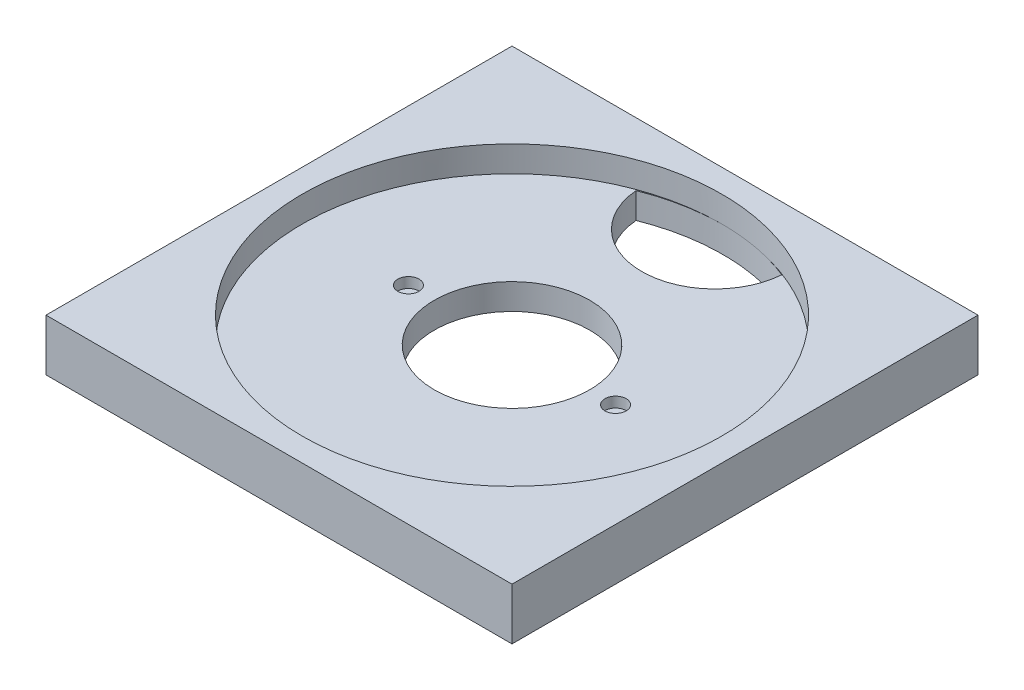
ISO-10303-21;
HEADER;
FILE_DESCRIPTION(('STEP AP214'),'2;1');
FILE_NAME('part.step','',(''),(''),'','','');
FILE_SCHEMA(('AUTOMOTIVE_DESIGN { 1 0 10303 214 1 1 1 1 }'));
ENDSEC;
DATA;
#1=APPLICATION_CONTEXT('core data for automotive mechanical design processes');
#2=APPLICATION_PROTOCOL_DEFINITION('international standard','automotive_design',2000,#1);
#3=PRODUCT_CONTEXT('',#1,'mechanical');
#4=PRODUCT('Part','Part','',(#3));
#5=PRODUCT_RELATED_PRODUCT_CATEGORY('part','',(#4));
#6=PRODUCT_DEFINITION_FORMATION('','',#4);
#7=PRODUCT_DEFINITION_CONTEXT('part definition',#1,'design');
#8=PRODUCT_DEFINITION('design','',#6,#7);
#9=PRODUCT_DEFINITION_SHAPE('','',#8);
#10=(LENGTH_UNIT() NAMED_UNIT(*) SI_UNIT(.MILLI.,.METRE.));
#11=(NAMED_UNIT(*) PLANE_ANGLE_UNIT() SI_UNIT($,.RADIAN.));
#12=(NAMED_UNIT(*) SI_UNIT($,.STERADIAN.) SOLID_ANGLE_UNIT());
#13=UNCERTAINTY_MEASURE_WITH_UNIT(LENGTH_MEASURE(1.E-05),#10,'distance_accuracy_value','');
#14=(GEOMETRIC_REPRESENTATION_CONTEXT(3) GLOBAL_UNCERTAINTY_ASSIGNED_CONTEXT((#13)) GLOBAL_UNIT_ASSIGNED_CONTEXT((#10,
#11,#12)) REPRESENTATION_CONTEXT('',''));
#15=CARTESIAN_POINT('',(0.,0.,0.));
#16=DIRECTION('',(0.,0.,1.));
#17=DIRECTION('',(1.,0.,0.));
#18=AXIS2_PLACEMENT_3D('',#15,#16,#17);
#19=CARTESIAN_POINT('',(0.,0.,0.));
#20=DIRECTION('',(0.,-1.,0.));
#21=DIRECTION('',(0.,0.,-1.));
#22=AXIS2_PLACEMENT_3D('',#19,#20,#21);
#23=PLANE('',#22);
#24=DIRECTION('',(-1.,0.,0.));
#25=VECTOR('',#24,1.);
#26=CARTESIAN_POINT('',(-45.,0.,-45.));
#27=LINE('',#26,#25);
#28=CARTESIAN_POINT('',(45.,0.,-45.));
#29=VERTEX_POINT('',#28);
#30=CARTESIAN_POINT('',(-45.,0.,-45.));
#31=VERTEX_POINT('',#30);
#32=EDGE_CURVE('E140',#29,#31,#27,.T.);
#33=ORIENTED_EDGE('',*,*,#32,.F.);
#34=DIRECTION('',(0.,0.,-1.));
#35=VECTOR('',#34,1.);
#36=CARTESIAN_POINT('',(45.,0.,-45.));
#37=LINE('',#36,#35);
#38=CARTESIAN_POINT('',(45.,0.,45.));
#39=VERTEX_POINT('',#38);
#40=EDGE_CURVE('E147',#39,#29,#37,.T.);
#41=ORIENTED_EDGE('',*,*,#40,.F.);
#42=DIRECTION('',(1.,0.,0.));
#43=VECTOR('',#42,1.);
#44=CARTESIAN_POINT('',(45.,0.,45.));
#45=LINE('',#44,#43);
#46=CARTESIAN_POINT('',(-45.,0.,45.));
#47=VERTEX_POINT('',#46);
#48=EDGE_CURVE('E158',#47,#39,#45,.T.);
#49=ORIENTED_EDGE('',*,*,#48,.F.);
#50=DIRECTION('',(0.,0.,1.));
#51=VECTOR('',#50,1.);
#52=CARTESIAN_POINT('',(-45.,0.,45.));
#53=LINE('',#52,#51);
#54=EDGE_CURVE('E155',#31,#47,#53,.T.);
#55=ORIENTED_EDGE('',*,*,#54,.F.);
#56=EDGE_LOOP('',(#33,#41,#49,#55));
#57=FACE_BOUND('',#56,.T.);
#58=CARTESIAN_POINT('',(0.,0.,0.));
#59=DIRECTION('',(0.,1.,0.));
#60=DIRECTION('',(0.,0.,1.));
#61=AXIS2_PLACEMENT_3D('',#58,#59,#60);
#62=CIRCLE('',#61,15.);
#63=CARTESIAN_POINT('',(0.,0.,15.));
#64=VERTEX_POINT('',#63);
#65=EDGE_CURVE('E120',#64,#64,#62,.T.);
#66=ORIENTED_EDGE('',*,*,#65,.T.);
#67=EDGE_LOOP('',(#66));
#68=FACE_BOUND('',#67,.T.);
#69=CARTESIAN_POINT('',(0.234545087504076,0.,-38.9391662557764));
#70=DIRECTION('',(0.,-1.,0.));
#71=DIRECTION('',(0.,0.,-1.));
#72=AXIS2_PLACEMENT_3D('',#69,#70,#71);
#73=CIRCLE('',#72,14.1220477581371);
#74=CARTESIAN_POINT('',(14.3106117901516,0.,-37.800491997824));
#75=VERTEX_POINT('',#74);
#76=CARTESIAN_POINT('',(-13.8415216151434,0.,-37.800491997824));
#77=VERTEX_POINT('',#76);
#78=EDGE_CURVE('E98',#75,#77,#73,.T.);
#79=ORIENTED_EDGE('',*,*,#78,.F.);
#80=CARTESIAN_POINT('',(0.234545087504078,0.,-2.50368837224554));
#81=DIRECTION('',(0.,-1.,0.));
#82=DIRECTION('',(0.,0.,-1.));
#83=AXIS2_PLACEMENT_3D('',#80,#81,#82);
#84=CIRCLE('',#83,38.0000000000004);
#85=EDGE_CURVE('E100',#75,#77,#84,.F.);
#86=ORIENTED_EDGE('',*,*,#85,.T.);
#87=EDGE_LOOP('',(#79,#86));
#88=FACE_BOUND('',#87,.T.);
#89=ADVANCED_FACE('F39',(#57,#68,#88),#23,.T.);
#90=CARTESIAN_POINT('',(-45.,10.,-45.));
#91=DIRECTION('',(0.,0.,1.));
#92=DIRECTION('',(1.,0.,0.));
#93=AXIS2_PLACEMENT_3D('',#90,#91,#92);
#94=PLANE('',#93);
#95=ORIENTED_EDGE('',*,*,#32,.T.);
#96=DIRECTION('',(0.,-1.,0.));
#97=VECTOR('',#96,1.);
#98=CARTESIAN_POINT('',(-45.,10.,-45.));
#99=LINE('',#98,#97);
#100=CARTESIAN_POINT('',(-45.,10.,-45.));
#101=VERTEX_POINT('',#100);
#102=EDGE_CURVE('E47',#101,#31,#99,.T.);
#103=ORIENTED_EDGE('',*,*,#102,.F.);
#104=DIRECTION('',(-1.,0.,0.));
#105=VECTOR('',#104,1.);
#106=CARTESIAN_POINT('',(0.,10.,-45.));
#107=LINE('',#106,#105);
#108=CARTESIAN_POINT('',(45.,10.,-45.));
#109=VERTEX_POINT('',#108);
#110=EDGE_CURVE('E144',#109,#101,#107,.T.);
#111=ORIENTED_EDGE('',*,*,#110,.F.);
#112=DIRECTION('',(0.,-1.,0.));
#113=VECTOR('',#112,1.);
#114=CARTESIAN_POINT('',(45.,10.,-45.));
#115=LINE('',#114,#113);
#116=EDGE_CURVE('E153',#109,#29,#115,.T.);
#117=ORIENTED_EDGE('',*,*,#116,.T.);
#118=EDGE_LOOP('',(#95,#103,#111,#117));
#119=FACE_BOUND('',#118,.T.);
#120=ADVANCED_FACE('F41',(#119),#94,.F.);
#121=CARTESIAN_POINT('',(-45.,10.,45.));
#122=DIRECTION('',(1.,0.,0.));
#123=DIRECTION('',(0.,0.,-1.));
#124=AXIS2_PLACEMENT_3D('',#121,#122,#123);
#125=PLANE('',#124);
#126=ORIENTED_EDGE('',*,*,#54,.T.);
#127=DIRECTION('',(0.,-1.,0.));
#128=VECTOR('',#127,1.);
#129=CARTESIAN_POINT('',(-45.,10.,45.));
#130=LINE('',#129,#128);
#131=CARTESIAN_POINT('',(-45.,10.,45.));
#132=VERTEX_POINT('',#131);
#133=EDGE_CURVE('E167',#132,#47,#130,.T.);
#134=ORIENTED_EDGE('',*,*,#133,.F.);
#135=DIRECTION('',(0.,0.,1.));
#136=VECTOR('',#135,1.);
#137=CARTESIAN_POINT('',(-45.,10.,45.));
#138=LINE('',#137,#136);
#139=EDGE_CURVE('E146',#101,#132,#138,.T.);
#140=ORIENTED_EDGE('',*,*,#139,.F.);
#141=ORIENTED_EDGE('',*,*,#102,.T.);
#142=EDGE_LOOP('',(#126,#134,#140,#141));
#143=FACE_BOUND('',#142,.T.);
#144=ADVANCED_FACE('F174',(#143),#125,.F.);
#145=CARTESIAN_POINT('',(45.,10.,45.));
#146=DIRECTION('',(0.,0.,-1.));
#147=DIRECTION('',(-1.,0.,0.));
#148=AXIS2_PLACEMENT_3D('',#145,#146,#147);
#149=PLANE('',#148);
#150=ORIENTED_EDGE('',*,*,#48,.T.);
#151=DIRECTION('',(0.,-1.,0.));
#152=VECTOR('',#151,1.);
#153=CARTESIAN_POINT('',(45.,10.,45.));
#154=LINE('',#153,#152);
#155=CARTESIAN_POINT('',(45.,10.,45.));
#156=VERTEX_POINT('',#155);
#157=EDGE_CURVE('E164',#156,#39,#154,.T.);
#158=ORIENTED_EDGE('',*,*,#157,.F.);
#159=DIRECTION('',(1.,0.,0.));
#160=VECTOR('',#159,1.);
#161=CARTESIAN_POINT('',(0.,10.,45.));
#162=LINE('',#161,#160);
#163=EDGE_CURVE('E149',#132,#156,#162,.T.);
#164=ORIENTED_EDGE('',*,*,#163,.F.);
#165=ORIENTED_EDGE('',*,*,#133,.T.);
#166=EDGE_LOOP('',(#150,#158,#164,#165));
#167=FACE_BOUND('',#166,.T.);
#168=ADVANCED_FACE('F183',(#167),#149,.F.);
#169=CARTESIAN_POINT('',(45.,10.,-45.));
#170=DIRECTION('',(-1.,0.,0.));
#171=DIRECTION('',(0.,0.,1.));
#172=AXIS2_PLACEMENT_3D('',#169,#170,#171);
#173=PLANE('',#172);
#174=ORIENTED_EDGE('',*,*,#40,.T.);
#175=ORIENTED_EDGE('',*,*,#116,.F.);
#176=DIRECTION('',(0.,0.,-1.));
#177=VECTOR('',#176,1.);
#178=CARTESIAN_POINT('',(45.,10.,-45.));
#179=LINE('',#178,#177);
#180=EDGE_CURVE('E151',#156,#109,#179,.T.);
#181=ORIENTED_EDGE('',*,*,#180,.F.);
#182=ORIENTED_EDGE('',*,*,#157,.T.);
#183=EDGE_LOOP('',(#174,#175,#181,#182));
#184=FACE_BOUND('',#183,.T.);
#185=ADVANCED_FACE('F187',(#184),#173,.F.);
#186=CARTESIAN_POINT('',(0.,10.,0.));
#187=DIRECTION('',(0.,-1.,0.));
#188=DIRECTION('',(0.,0.,-1.));
#189=AXIS2_PLACEMENT_3D('',#186,#187,#188);
#190=PLANE('',#189);
#191=CARTESIAN_POINT('',(0.,10.,0.));
#192=DIRECTION('',(0.,1.,0.));
#193=DIRECTION('',(0.,0.,1.));
#194=AXIS2_PLACEMENT_3D('',#191,#192,#193);
#195=CIRCLE('',#194,40.5);
#196=CARTESIAN_POINT('',(0.,10.,40.5));
#197=VERTEX_POINT('',#196);
#198=EDGE_CURVE('E129',#197,#197,#195,.T.);
#199=ORIENTED_EDGE('',*,*,#198,.F.);
#200=EDGE_LOOP('',(#199));
#201=FACE_BOUND('',#200,.T.);
#202=ORIENTED_EDGE('',*,*,#110,.T.);
#203=ORIENTED_EDGE('',*,*,#139,.T.);
#204=ORIENTED_EDGE('',*,*,#163,.T.);
#205=ORIENTED_EDGE('',*,*,#180,.T.);
#206=EDGE_LOOP('',(#202,#203,#204,#205));
#207=FACE_BOUND('',#206,.T.);
#208=ADVANCED_FACE('F190',(#201,#207),#190,.F.);
#209=CARTESIAN_POINT('',(0.,5.,0.));
#210=DIRECTION('',(0.,1.,0.));
#211=DIRECTION('',(0.,0.,1.));
#212=AXIS2_PLACEMENT_3D('',#209,#210,#211);
#213=CYLINDRICAL_SURFACE('',#212,40.5);
#214=CARTESIAN_POINT('',(0.,5.,0.));
#215=DIRECTION('',(0.,1.,0.));
#216=DIRECTION('',(0.,0.,1.));
#217=AXIS2_PLACEMENT_3D('',#214,#215,#216);
#218=CIRCLE('',#217,40.5);
#219=CARTESIAN_POINT('',(7.96690062199776,5.,-39.7086702683332));
#220=VERTEX_POINT('',#219);
#221=CARTESIAN_POINT('',(-0.453204015702651,5.,-40.4974641937017));
#222=VERTEX_POINT('',#221);
#223=EDGE_CURVE('E138',#220,#222,#218,.T.);
#224=ORIENTED_EDGE('',*,*,#223,.F.);
#225=EDGE_CURVE('E141',#222,#220,#218,.T.);
#226=ORIENTED_EDGE('',*,*,#225,.F.);
#227=EDGE_LOOP('',(#224,#226));
#228=FACE_BOUND('',#227,.T.);
#229=ORIENTED_EDGE('',*,*,#198,.T.);
#230=EDGE_LOOP('',(#229));
#231=FACE_BOUND('',#230,.T.);
#232=ADVANCED_FACE('F223',(#228,#231),#213,.F.);
#233=CARTESIAN_POINT('',(0.,5.,0.));
#234=DIRECTION('',(0.,1.,0.));
#235=DIRECTION('',(0.,0.,1.));
#236=AXIS2_PLACEMENT_3D('',#233,#234,#235);
#237=PLANE('',#236);
#238=CARTESIAN_POINT('',(0.,5.,0.));
#239=DIRECTION('',(0.,1.,0.));
#240=DIRECTION('',(0.,0.,1.));
#241=AXIS2_PLACEMENT_3D('',#238,#239,#240);
#242=CIRCLE('',#241,15.);
#243=CARTESIAN_POINT('',(0.,5.,15.));
#244=VERTEX_POINT('',#243);
#245=EDGE_CURVE('E119',#244,#244,#242,.T.);
#246=ORIENTED_EDGE('',*,*,#245,.F.);
#247=EDGE_LOOP('',(#246));
#248=FACE_BOUND('',#247,.T.);
#249=CARTESIAN_POINT('',(-20.,5.,0.));
#250=DIRECTION('',(0.,1.,0.));
#251=DIRECTION('',(0.,0.,1.));
#252=AXIS2_PLACEMENT_3D('',#249,#250,#251);
#253=CIRCLE('',#252,2.05);
#254=CARTESIAN_POINT('',(-20.,5.,2.05));
#255=VERTEX_POINT('',#254);
#256=EDGE_CURVE('E130',#255,#255,#253,.T.);
#257=ORIENTED_EDGE('',*,*,#256,.F.);
#258=EDGE_LOOP('',(#257));
#259=FACE_BOUND('',#258,.T.);
#260=CARTESIAN_POINT('',(20.,5.,0.));
#261=DIRECTION('',(0.,1.,0.));
#262=DIRECTION('',(0.,0.,1.));
#263=AXIS2_PLACEMENT_3D('',#260,#261,#262);
#264=CIRCLE('',#263,2.05);
#265=CARTESIAN_POINT('',(20.,5.,2.05));
#266=VERTEX_POINT('',#265);
#267=EDGE_CURVE('E133',#266,#266,#264,.T.);
#268=ORIENTED_EDGE('',*,*,#267,.F.);
#269=EDGE_LOOP('',(#268));
#270=FACE_BOUND('',#269,.T.);
#271=CARTESIAN_POINT('',(0.234545087504076,5.,-38.9391662557764));
#272=DIRECTION('',(0.,1.,0.));
#273=DIRECTION('',(0.,0.,1.));
#274=AXIS2_PLACEMENT_3D('',#271,#272,#273);
#275=CIRCLE('',#274,14.1220477581371);
#276=CARTESIAN_POINT('',(-13.8415216151434,5.,-37.800491997824));
#277=VERTEX_POINT('',#276);
#278=CARTESIAN_POINT('',(14.3106117901516,5.,-37.800491997824));
#279=VERTEX_POINT('',#278);
#280=EDGE_CURVE('E61',#277,#279,#275,.T.);
#281=ORIENTED_EDGE('',*,*,#280,.F.);
#282=CARTESIAN_POINT('',(0.234545087504078,5.,-2.50368837224554));
#283=DIRECTION('',(0.,-1.,0.));
#284=DIRECTION('',(0.,0.,-1.));
#285=AXIS2_PLACEMENT_3D('',#282,#283,#284);
#286=CIRCLE('',#285,38.0000000000004);
#287=EDGE_CURVE('E105',#277,#222,#286,.T.);
#288=ORIENTED_EDGE('',*,*,#287,.T.);
#289=ORIENTED_EDGE('',*,*,#225,.T.);
#290=CARTESIAN_POINT('',(0.234545087504078,5.,-2.50368837224554));
#291=DIRECTION('',(0.,1.,0.));
#292=DIRECTION('',(0.,0.,1.));
#293=AXIS2_PLACEMENT_3D('',#290,#291,#292);
#294=CIRCLE('',#293,38.0000000000004);
#295=EDGE_CURVE('E11',#220,#279,#294,.F.);
#296=ORIENTED_EDGE('',*,*,#295,.T.);
#297=EDGE_LOOP('',(#281,#288,#289,#296));
#298=FACE_BOUND('',#297,.T.);
#299=ADVANCED_FACE('F113',(#248,#259,#270,#298),#237,.T.);
#300=CARTESIAN_POINT('',(20.,3.,0.));
#301=DIRECTION('',(0.,1.,0.));
#302=DIRECTION('',(0.,0.,1.));
#303=AXIS2_PLACEMENT_3D('',#300,#301,#302);
#304=CYLINDRICAL_SURFACE('',#303,2.05);
#305=CARTESIAN_POINT('',(20.,3.,0.));
#306=DIRECTION('',(0.,1.,0.));
#307=DIRECTION('',(0.,0.,1.));
#308=AXIS2_PLACEMENT_3D('',#305,#306,#307);
#309=CIRCLE('',#308,2.05);
#310=CARTESIAN_POINT('',(20.,3.,2.05));
#311=VERTEX_POINT('',#310);
#312=EDGE_CURVE('E123',#311,#311,#309,.T.);
#313=ORIENTED_EDGE('',*,*,#312,.F.);
#314=EDGE_LOOP('',(#313));
#315=FACE_BOUND('',#314,.T.);
#316=ORIENTED_EDGE('',*,*,#267,.T.);
#317=EDGE_LOOP('',(#316));
#318=FACE_BOUND('',#317,.T.);
#319=ADVANCED_FACE('F229',(#315,#318),#304,.F.);
#320=CARTESIAN_POINT('',(20.,3.,0.));
#321=DIRECTION('',(0.,1.,0.));
#322=DIRECTION('',(0.,0.,1.));
#323=AXIS2_PLACEMENT_3D('',#320,#321,#322);
#324=PLANE('',#323);
#325=ORIENTED_EDGE('',*,*,#312,.T.);
#326=EDGE_LOOP('',(#325));
#327=FACE_BOUND('',#326,.T.);
#328=ADVANCED_FACE('F233',(#327),#324,.T.);
#329=CARTESIAN_POINT('',(-20.,3.,0.));
#330=DIRECTION('',(0.,1.,0.));
#331=DIRECTION('',(0.,0.,1.));
#332=AXIS2_PLACEMENT_3D('',#329,#330,#331);
#333=CYLINDRICAL_SURFACE('',#332,2.05);
#334=CARTESIAN_POINT('',(-20.,3.,0.));
#335=DIRECTION('',(0.,1.,0.));
#336=DIRECTION('',(0.,0.,1.));
#337=AXIS2_PLACEMENT_3D('',#334,#335,#336);
#338=CIRCLE('',#337,2.05);
#339=CARTESIAN_POINT('',(-20.,3.,2.05));
#340=VERTEX_POINT('',#339);
#341=EDGE_CURVE('E126',#340,#340,#338,.T.);
#342=ORIENTED_EDGE('',*,*,#341,.F.);
#343=EDGE_LOOP('',(#342));
#344=FACE_BOUND('',#343,.T.);
#345=ORIENTED_EDGE('',*,*,#256,.T.);
#346=EDGE_LOOP('',(#345));
#347=FACE_BOUND('',#346,.T.);
#348=ADVANCED_FACE('F243',(#344,#347),#333,.F.);
#349=CARTESIAN_POINT('',(-20.,3.,0.));
#350=DIRECTION('',(0.,1.,0.));
#351=DIRECTION('',(0.,0.,1.));
#352=AXIS2_PLACEMENT_3D('',#349,#350,#351);
#353=PLANE('',#352);
#354=ORIENTED_EDGE('',*,*,#341,.T.);
#355=EDGE_LOOP('',(#354));
#356=FACE_BOUND('',#355,.T.);
#357=ADVANCED_FACE('F252',(#356),#353,.T.);
#358=CARTESIAN_POINT('',(0.,0.,0.));
#359=DIRECTION('',(0.,1.,0.));
#360=DIRECTION('',(0.,0.,1.));
#361=AXIS2_PLACEMENT_3D('',#358,#359,#360);
#362=CYLINDRICAL_SURFACE('',#361,15.);
#363=ORIENTED_EDGE('',*,*,#65,.F.);
#364=EDGE_LOOP('',(#363));
#365=FACE_BOUND('',#364,.T.);
#366=ORIENTED_EDGE('',*,*,#245,.T.);
#367=EDGE_LOOP('',(#366));
#368=FACE_BOUND('',#367,.T.);
#369=ADVANCED_FACE('F260',(#365,#368),#362,.F.);
#370=CARTESIAN_POINT('',(0.234545087504077,5.,-20.721427314011));
#371=DIRECTION('',(0.,1.,0.));
#372=DIRECTION('',(0.,0.,1.));
#373=AXIS2_PLACEMENT_3D('',#370,#371,#372);
#374=PLANE('',#373);
#375=EDGE_CURVE('E108',#222,#220,#286,.T.);
#376=ORIENTED_EDGE('',*,*,#375,.T.);
#377=ORIENTED_EDGE('',*,*,#223,.T.);
#378=EDGE_LOOP('',(#376,#377));
#379=FACE_BOUND('',#378,.T.);
#380=ADVANCED_FACE('F268',(#379),#374,.F.);
#381=CARTESIAN_POINT('',(0.234545087504076,-31.,-38.9391662557764));
#382=DIRECTION('',(0.,1.,0.));
#383=DIRECTION('',(0.,0.,1.));
#384=AXIS2_PLACEMENT_3D('',#381,#382,#383);
#385=CYLINDRICAL_SURFACE('',#384,14.1220477581371);
#386=ORIENTED_EDGE('',*,*,#78,.T.);
#387=DIRECTION('',(0.,1.,0.));
#388=VECTOR('',#387,1.);
#389=CARTESIAN_POINT('',(-13.8415216151434,-31.,-37.800491997824));
#390=LINE('',#389,#388);
#391=EDGE_CURVE('E54',#77,#277,#390,.T.);
#392=ORIENTED_EDGE('',*,*,#391,.T.);
#393=ORIENTED_EDGE('',*,*,#280,.T.);
#394=DIRECTION('',(0.,1.,0.));
#395=VECTOR('',#394,1.);
#396=CARTESIAN_POINT('',(14.3106117901516,-31.,-37.800491997824));
#397=LINE('',#396,#395);
#398=EDGE_CURVE('E101',#75,#279,#397,.T.);
#399=ORIENTED_EDGE('',*,*,#398,.F.);
#400=EDGE_LOOP('',(#386,#392,#393,#399));
#401=FACE_BOUND('',#400,.T.);
#402=ADVANCED_FACE('F96',(#401),#385,.F.);
#403=CARTESIAN_POINT('',(0.234545087504078,-31.,-2.50368837224554));
#404=DIRECTION('',(0.,1.,0.));
#405=DIRECTION('',(0.,0.,1.));
#406=AXIS2_PLACEMENT_3D('',#403,#404,#405);
#407=CYLINDRICAL_SURFACE('',#406,38.0000000000004);
#408=ORIENTED_EDGE('',*,*,#398,.T.);
#409=ORIENTED_EDGE('',*,*,#295,.F.);
#410=ORIENTED_EDGE('',*,*,#375,.F.);
#411=ORIENTED_EDGE('',*,*,#287,.F.);
#412=ORIENTED_EDGE('',*,*,#391,.F.);
#413=ORIENTED_EDGE('',*,*,#85,.F.);
#414=EDGE_LOOP('',(#408,#409,#410,#411,#412,#413));
#415=FACE_BOUND('',#414,.T.);
#416=ADVANCED_FACE('F106',(#415),#407,.F.);
#417=CLOSED_SHELL('',(#89,#120,#144,#168,#185,#208,#232,#299,#319,#328,#348,#357,#369,#380,#402,#416));
#418=MANIFOLD_SOLID_BREP('B2',#417);
#419=ADVANCED_BREP_SHAPE_REPRESENTATION('',(#18,#418),#14);
#420=SHAPE_DEFINITION_REPRESENTATION(#9,#419);
ENDSEC;
END-ISO-10303-21;
